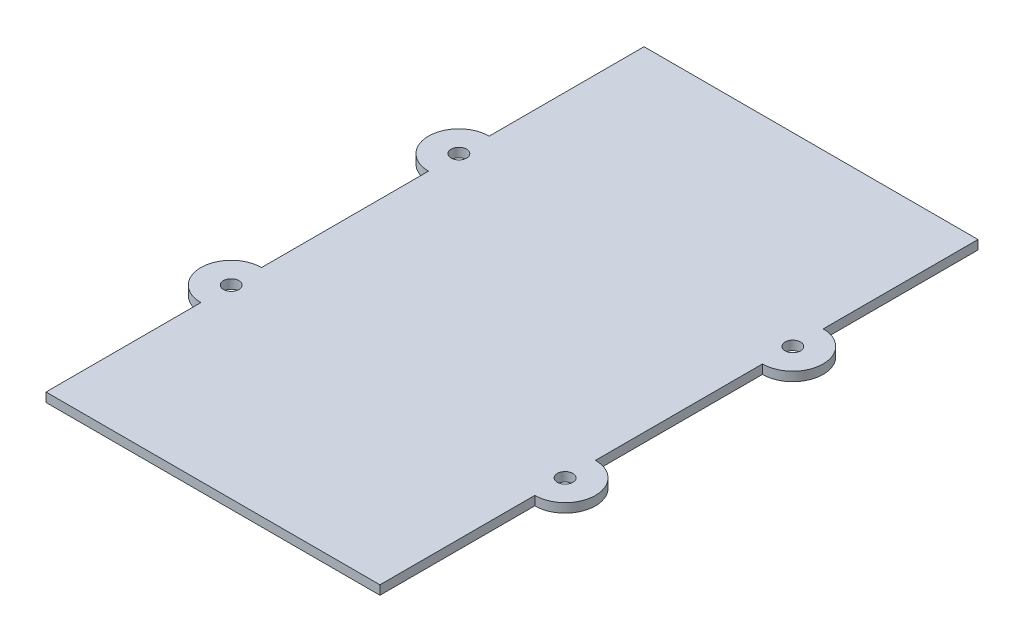
ISO-10303-21;
HEADER;
FILE_DESCRIPTION(('STEP AP214'),'2;1');
FILE_NAME('part.step','',(''),(''),'','','');
FILE_SCHEMA(('AUTOMOTIVE_DESIGN { 1 0 10303 214 1 1 1 1 }'));
ENDSEC;
DATA;
#1=APPLICATION_CONTEXT('core data for automotive mechanical design processes');
#2=APPLICATION_PROTOCOL_DEFINITION('international standard','automotive_design',2000,#1);
#3=PRODUCT_CONTEXT('',#1,'mechanical');
#4=PRODUCT('Part','Part','',(#3));
#5=PRODUCT_RELATED_PRODUCT_CATEGORY('part','',(#4));
#6=PRODUCT_DEFINITION_FORMATION('','',#4);
#7=PRODUCT_DEFINITION_CONTEXT('part definition',#1,'design');
#8=PRODUCT_DEFINITION('design','',#6,#7);
#9=PRODUCT_DEFINITION_SHAPE('','',#8);
#10=(LENGTH_UNIT() NAMED_UNIT(*) SI_UNIT(.MILLI.,.METRE.));
#11=(NAMED_UNIT(*) PLANE_ANGLE_UNIT() SI_UNIT($,.RADIAN.));
#12=(NAMED_UNIT(*) SI_UNIT($,.STERADIAN.) SOLID_ANGLE_UNIT());
#13=UNCERTAINTY_MEASURE_WITH_UNIT(LENGTH_MEASURE(1.E-05),#10,'distance_accuracy_value','');
#14=(GEOMETRIC_REPRESENTATION_CONTEXT(3) GLOBAL_UNCERTAINTY_ASSIGNED_CONTEXT((#13)) GLOBAL_UNIT_ASSIGNED_CONTEXT((#10,
#11,#12)) REPRESENTATION_CONTEXT('',''));
#15=CARTESIAN_POINT('',(0.,0.,0.));
#16=DIRECTION('',(0.,0.,1.));
#17=DIRECTION('',(1.,0.,0.));
#18=AXIS2_PLACEMENT_3D('',#15,#16,#17);
#19=CARTESIAN_POINT('',(-55.,3.,-37.5));
#20=DIRECTION('',(0.,1.,0.));
#21=DIRECTION('',(0.,0.,1.));
#22=AXIS2_PLACEMENT_3D('',#19,#20,#21);
#23=PLANE('',#22);
#24=CARTESIAN_POINT('',(-55.,3.,37.5));
#25=DIRECTION('',(0.,1.,0.));
#26=DIRECTION('',(0.,0.,1.));
#27=AXIS2_PLACEMENT_3D('',#24,#25,#26);
#28=CIRCLE('',#27,2.54999999999999);
#29=CARTESIAN_POINT('',(-55.,3.,40.05));
#30=VERTEX_POINT('',#29);
#31=EDGE_CURVE('E293',#30,#30,#28,.T.);
#32=ORIENTED_EDGE('',*,*,#31,.F.);
#33=EDGE_LOOP('',(#32));
#34=FACE_BOUND('',#33,.T.);
#35=CARTESIAN_POINT('',(-55.,3.,-37.5));
#36=DIRECTION('',(0.,1.,0.));
#37=DIRECTION('',(0.,0.,1.));
#38=AXIS2_PLACEMENT_3D('',#35,#36,#37);
#39=CIRCLE('',#38,2.54999999999999);
#40=CARTESIAN_POINT('',(-55.,3.,-34.95));
#41=VERTEX_POINT('',#40);
#42=EDGE_CURVE('E160',#41,#41,#39,.T.);
#43=ORIENTED_EDGE('',*,*,#42,.F.);
#44=EDGE_LOOP('',(#43));
#45=FACE_BOUND('',#44,.T.);
#46=CARTESIAN_POINT('',(-55.,3.,-37.5));
#47=DIRECTION('',(0.,1.,0.));
#48=DIRECTION('',(0.,0.,1.));
#49=AXIS2_PLACEMENT_3D('',#46,#47,#48);
#50=CIRCLE('',#49,10.);
#51=CARTESIAN_POINT('',(-55.,3.,-47.5));
#52=VERTEX_POINT('',#51);
#53=CARTESIAN_POINT('',(-55.,3.,-27.5));
#54=VERTEX_POINT('',#53);
#55=EDGE_CURVE('E179',#52,#54,#50,.T.);
#56=ORIENTED_EDGE('',*,*,#55,.T.);
#57=DIRECTION('',(0.,0.,1.));
#58=VECTOR('',#57,1.);
#59=CARTESIAN_POINT('',(-55.,3.,-27.5));
#60=LINE('',#59,#58);
#61=CARTESIAN_POINT('',(-55.,3.,27.5));
#62=VERTEX_POINT('',#61);
#63=EDGE_CURVE('E107',#54,#62,#60,.T.);
#64=ORIENTED_EDGE('',*,*,#63,.T.);
#65=CARTESIAN_POINT('',(-55.,3.,37.5));
#66=DIRECTION('',(0.,1.,0.));
#67=DIRECTION('',(0.,0.,1.));
#68=AXIS2_PLACEMENT_3D('',#65,#66,#67);
#69=CIRCLE('',#68,10.);
#70=CARTESIAN_POINT('',(-55.,3.,47.5));
#71=VERTEX_POINT('',#70);
#72=EDGE_CURVE('E206',#62,#71,#69,.T.);
#73=ORIENTED_EDGE('',*,*,#72,.T.);
#74=DIRECTION('',(0.,0.,1.));
#75=VECTOR('',#74,1.);
#76=CARTESIAN_POINT('',(-55.,3.,47.5));
#77=LINE('',#76,#75);
#78=CARTESIAN_POINT('',(-55.,3.,98.5));
#79=VERTEX_POINT('',#78);
#80=EDGE_CURVE('E225',#71,#79,#77,.T.);
#81=ORIENTED_EDGE('',*,*,#80,.T.);
#82=DIRECTION('',(1.,0.,0.));
#83=VECTOR('',#82,1.);
#84=CARTESIAN_POINT('',(-55.,3.,98.5));
#85=LINE('',#84,#83);
#86=CARTESIAN_POINT('',(55.,3.,98.5));
#87=VERTEX_POINT('',#86);
#88=EDGE_CURVE('E222',#79,#87,#85,.T.);
#89=ORIENTED_EDGE('',*,*,#88,.T.);
#90=DIRECTION('',(0.,0.,-1.));
#91=VECTOR('',#90,1.);
#92=CARTESIAN_POINT('',(55.,3.,47.5));
#93=LINE('',#92,#91);
#94=CARTESIAN_POINT('',(55.,3.,47.5));
#95=VERTEX_POINT('',#94);
#96=EDGE_CURVE('E224',#87,#95,#93,.T.);
#97=ORIENTED_EDGE('',*,*,#96,.T.);
#98=CARTESIAN_POINT('',(55.,3.,37.5));
#99=DIRECTION('',(0.,1.,0.));
#100=DIRECTION('',(0.,0.,-1.));
#101=AXIS2_PLACEMENT_3D('',#98,#99,#100);
#102=CIRCLE('',#101,10.);
#103=CARTESIAN_POINT('',(55.,3.,27.5));
#104=VERTEX_POINT('',#103);
#105=EDGE_CURVE('E227',#95,#104,#102,.T.);
#106=ORIENTED_EDGE('',*,*,#105,.T.);
#107=DIRECTION('',(0.,0.,-1.));
#108=VECTOR('',#107,1.);
#109=CARTESIAN_POINT('',(55.,3.,-27.5));
#110=LINE('',#109,#108);
#111=CARTESIAN_POINT('',(55.,3.,-27.5));
#112=VERTEX_POINT('',#111);
#113=EDGE_CURVE('E233',#104,#112,#110,.T.);
#114=ORIENTED_EDGE('',*,*,#113,.T.);
#115=CARTESIAN_POINT('',(55.,3.,-37.5));
#116=DIRECTION('',(0.,1.,0.));
#117=DIRECTION('',(0.,0.,-1.));
#118=AXIS2_PLACEMENT_3D('',#115,#116,#117);
#119=CIRCLE('',#118,10.);
#120=CARTESIAN_POINT('',(55.,3.,-47.5));
#121=VERTEX_POINT('',#120);
#122=EDGE_CURVE('E138',#112,#121,#119,.T.);
#123=ORIENTED_EDGE('',*,*,#122,.T.);
#124=DIRECTION('',(0.,0.,-1.));
#125=VECTOR('',#124,1.);
#126=CARTESIAN_POINT('',(55.,3.,-98.5));
#127=LINE('',#126,#125);
#128=CARTESIAN_POINT('',(55.,3.,-98.5));
#129=VERTEX_POINT('',#128);
#130=EDGE_CURVE('E132',#121,#129,#127,.T.);
#131=ORIENTED_EDGE('',*,*,#130,.T.);
#132=DIRECTION('',(-1.,0.,0.));
#133=VECTOR('',#132,1.);
#134=CARTESIAN_POINT('',(-55.,3.,-98.5));
#135=LINE('',#134,#133);
#136=CARTESIAN_POINT('',(-55.,3.,-98.5));
#137=VERTEX_POINT('',#136);
#138=EDGE_CURVE('E136',#129,#137,#135,.T.);
#139=ORIENTED_EDGE('',*,*,#138,.T.);
#140=DIRECTION('',(0.,0.,1.));
#141=VECTOR('',#140,1.);
#142=CARTESIAN_POINT('',(-55.,3.,-47.5));
#143=LINE('',#142,#141);
#144=EDGE_CURVE('E52',#137,#52,#143,.T.);
#145=ORIENTED_EDGE('',*,*,#144,.T.);
#146=EDGE_LOOP('',(#56,#64,#73,#81,#89,#97,#106,#114,#123,#131,#139,#145));
#147=FACE_BOUND('',#146,.T.);
#148=CARTESIAN_POINT('',(55.,3.,-37.5));
#149=DIRECTION('',(0.,1.,0.));
#150=DIRECTION('',(0.,0.,1.));
#151=AXIS2_PLACEMENT_3D('',#148,#149,#150);
#152=CIRCLE('',#151,2.55);
#153=CARTESIAN_POINT('',(55.,3.,-34.95));
#154=VERTEX_POINT('',#153);
#155=EDGE_CURVE('E299',#154,#154,#152,.T.);
#156=ORIENTED_EDGE('',*,*,#155,.F.);
#157=EDGE_LOOP('',(#156));
#158=FACE_BOUND('',#157,.T.);
#159=CARTESIAN_POINT('',(55.,3.,37.5));
#160=DIRECTION('',(0.,1.,0.));
#161=DIRECTION('',(0.,0.,1.));
#162=AXIS2_PLACEMENT_3D('',#159,#160,#161);
#163=CIRCLE('',#162,2.55);
#164=CARTESIAN_POINT('',(55.,3.,40.05));
#165=VERTEX_POINT('',#164);
#166=EDGE_CURVE('E284',#165,#165,#163,.T.);
#167=ORIENTED_EDGE('',*,*,#166,.F.);
#168=EDGE_LOOP('',(#167));
#169=FACE_BOUND('',#168,.T.);
#170=ADVANCED_FACE('F35',(#34,#45,#147,#158,#169),#23,.T.);
#171=CARTESIAN_POINT('',(-55.,0.,-37.5));
#172=DIRECTION('',(0.,1.,0.));
#173=DIRECTION('',(0.,0.,1.));
#174=AXIS2_PLACEMENT_3D('',#171,#172,#173);
#175=PLANE('',#174);
#176=CARTESIAN_POINT('',(-55.,0.,-37.5));
#177=DIRECTION('',(0.,1.,0.));
#178=DIRECTION('',(0.,0.,1.));
#179=AXIS2_PLACEMENT_3D('',#176,#177,#178);
#180=CIRCLE('',#179,10.);
#181=CARTESIAN_POINT('',(-55.,0.,-47.5));
#182=VERTEX_POINT('',#181);
#183=CARTESIAN_POINT('',(-55.,0.,-27.5));
#184=VERTEX_POINT('',#183);
#185=EDGE_CURVE('E156',#182,#184,#180,.T.);
#186=ORIENTED_EDGE('',*,*,#185,.F.);
#187=DIRECTION('',(0.,0.,1.));
#188=VECTOR('',#187,1.);
#189=CARTESIAN_POINT('',(-55.,0.,-47.5));
#190=LINE('',#189,#188);
#191=CARTESIAN_POINT('',(-55.,0.,-98.5));
#192=VERTEX_POINT('',#191);
#193=EDGE_CURVE('E99',#192,#182,#190,.T.);
#194=ORIENTED_EDGE('',*,*,#193,.F.);
#195=DIRECTION('',(-1.,0.,0.));
#196=VECTOR('',#195,1.);
#197=CARTESIAN_POINT('',(-55.,0.,-98.5));
#198=LINE('',#197,#196);
#199=CARTESIAN_POINT('',(55.,0.,-98.5));
#200=VERTEX_POINT('',#199);
#201=EDGE_CURVE('E93',#200,#192,#198,.T.);
#202=ORIENTED_EDGE('',*,*,#201,.F.);
#203=DIRECTION('',(0.,0.,-1.));
#204=VECTOR('',#203,1.);
#205=CARTESIAN_POINT('',(55.,0.,-98.5));
#206=LINE('',#205,#204);
#207=CARTESIAN_POINT('',(55.,0.,-47.5));
#208=VERTEX_POINT('',#207);
#209=EDGE_CURVE('E146',#208,#200,#206,.T.);
#210=ORIENTED_EDGE('',*,*,#209,.F.);
#211=CARTESIAN_POINT('',(55.,0.,-37.5));
#212=DIRECTION('',(0.,1.,0.));
#213=DIRECTION('',(0.,0.,-1.));
#214=AXIS2_PLACEMENT_3D('',#211,#212,#213);
#215=CIRCLE('',#214,10.);
#216=CARTESIAN_POINT('',(55.,0.,-27.5));
#217=VERTEX_POINT('',#216);
#218=EDGE_CURVE('E174',#217,#208,#215,.T.);
#219=ORIENTED_EDGE('',*,*,#218,.F.);
#220=DIRECTION('',(0.,0.,-1.));
#221=VECTOR('',#220,1.);
#222=CARTESIAN_POINT('',(55.,0.,-27.5));
#223=LINE('',#222,#221);
#224=CARTESIAN_POINT('',(55.,0.,27.5));
#225=VERTEX_POINT('',#224);
#226=EDGE_CURVE('E172',#225,#217,#223,.T.);
#227=ORIENTED_EDGE('',*,*,#226,.F.);
#228=CARTESIAN_POINT('',(55.,0.,37.5));
#229=DIRECTION('',(0.,1.,0.));
#230=DIRECTION('',(0.,0.,-1.));
#231=AXIS2_PLACEMENT_3D('',#228,#229,#230);
#232=CIRCLE('',#231,10.);
#233=CARTESIAN_POINT('',(55.,0.,47.5));
#234=VERTEX_POINT('',#233);
#235=EDGE_CURVE('E170',#234,#225,#232,.T.);
#236=ORIENTED_EDGE('',*,*,#235,.F.);
#237=DIRECTION('',(0.,0.,-1.));
#238=VECTOR('',#237,1.);
#239=CARTESIAN_POINT('',(55.,0.,47.5));
#240=LINE('',#239,#238);
#241=CARTESIAN_POINT('',(55.,0.,98.5));
#242=VERTEX_POINT('',#241);
#243=EDGE_CURVE('E168',#242,#234,#240,.T.);
#244=ORIENTED_EDGE('',*,*,#243,.F.);
#245=DIRECTION('',(1.,0.,0.));
#246=VECTOR('',#245,1.);
#247=CARTESIAN_POINT('',(-55.,0.,98.5));
#248=LINE('',#247,#246);
#249=CARTESIAN_POINT('',(-55.,0.,98.5));
#250=VERTEX_POINT('',#249);
#251=EDGE_CURVE('E166',#250,#242,#248,.T.);
#252=ORIENTED_EDGE('',*,*,#251,.F.);
#253=DIRECTION('',(0.,0.,1.));
#254=VECTOR('',#253,1.);
#255=CARTESIAN_POINT('',(-55.,0.,47.5));
#256=LINE('',#255,#254);
#257=CARTESIAN_POINT('',(-55.,0.,47.5));
#258=VERTEX_POINT('',#257);
#259=EDGE_CURVE('E164',#258,#250,#256,.T.);
#260=ORIENTED_EDGE('',*,*,#259,.F.);
#261=CARTESIAN_POINT('',(-55.,0.,37.5));
#262=DIRECTION('',(0.,1.,0.));
#263=DIRECTION('',(0.,0.,1.));
#264=AXIS2_PLACEMENT_3D('',#261,#262,#263);
#265=CIRCLE('',#264,10.);
#266=CARTESIAN_POINT('',(-55.,0.,27.5));
#267=VERTEX_POINT('',#266);
#268=EDGE_CURVE('E162',#267,#258,#265,.T.);
#269=ORIENTED_EDGE('',*,*,#268,.F.);
#270=DIRECTION('',(0.,0.,1.));
#271=VECTOR('',#270,1.);
#272=CARTESIAN_POINT('',(-55.,0.,-27.5));
#273=LINE('',#272,#271);
#274=EDGE_CURVE('E159',#184,#267,#273,.T.);
#275=ORIENTED_EDGE('',*,*,#274,.F.);
#276=EDGE_LOOP('',(#186,#194,#202,#210,#219,#227,#236,#244,#252,#260,#269,#275));
#277=FACE_BOUND('',#276,.T.);
#278=CARTESIAN_POINT('',(-55.,0.,-37.5));
#279=DIRECTION('',(0.,1.,0.));
#280=DIRECTION('',(0.,0.,1.));
#281=AXIS2_PLACEMENT_3D('',#278,#279,#280);
#282=CIRCLE('',#281,2.54999999999999);
#283=CARTESIAN_POINT('',(-55.,0.,-34.95));
#284=VERTEX_POINT('',#283);
#285=EDGE_CURVE('E302',#284,#284,#282,.T.);
#286=ORIENTED_EDGE('',*,*,#285,.T.);
#287=EDGE_LOOP('',(#286));
#288=FACE_BOUND('',#287,.T.);
#289=CARTESIAN_POINT('',(55.,0.,-37.5));
#290=DIRECTION('',(0.,1.,0.));
#291=DIRECTION('',(0.,0.,1.));
#292=AXIS2_PLACEMENT_3D('',#289,#290,#291);
#293=CIRCLE('',#292,2.55);
#294=CARTESIAN_POINT('',(55.,0.,-34.95));
#295=VERTEX_POINT('',#294);
#296=EDGE_CURVE('E296',#295,#295,#293,.T.);
#297=ORIENTED_EDGE('',*,*,#296,.T.);
#298=EDGE_LOOP('',(#297));
#299=FACE_BOUND('',#298,.T.);
#300=CARTESIAN_POINT('',(-55.,0.,37.5));
#301=DIRECTION('',(0.,1.,0.));
#302=DIRECTION('',(0.,0.,1.));
#303=AXIS2_PLACEMENT_3D('',#300,#301,#302);
#304=CIRCLE('',#303,2.54999999999999);
#305=CARTESIAN_POINT('',(-55.,0.,40.05));
#306=VERTEX_POINT('',#305);
#307=EDGE_CURVE('E290',#306,#306,#304,.T.);
#308=ORIENTED_EDGE('',*,*,#307,.T.);
#309=EDGE_LOOP('',(#308));
#310=FACE_BOUND('',#309,.T.);
#311=CARTESIAN_POINT('',(55.,0.,37.5));
#312=DIRECTION('',(0.,1.,0.));
#313=DIRECTION('',(0.,0.,1.));
#314=AXIS2_PLACEMENT_3D('',#311,#312,#313);
#315=CIRCLE('',#314,2.55);
#316=CARTESIAN_POINT('',(55.,0.,40.05));
#317=VERTEX_POINT('',#316);
#318=EDGE_CURVE('E287',#317,#317,#315,.T.);
#319=ORIENTED_EDGE('',*,*,#318,.T.);
#320=EDGE_LOOP('',(#319));
#321=FACE_BOUND('',#320,.T.);
#322=ADVANCED_FACE('F210',(#277,#288,#299,#310,#321),#175,.F.);
#323=CARTESIAN_POINT('',(-55.,3.,-37.5));
#324=DIRECTION('',(0.,-1.,0.));
#325=DIRECTION('',(0.,0.,-1.));
#326=AXIS2_PLACEMENT_3D('',#323,#324,#325);
#327=CYLINDRICAL_SURFACE('',#326,10.);
#328=ORIENTED_EDGE('',*,*,#185,.T.);
#329=DIRECTION('',(0.,-1.,0.));
#330=VECTOR('',#329,1.);
#331=CARTESIAN_POINT('',(-55.,3.,-27.5));
#332=LINE('',#331,#330);
#333=EDGE_CURVE('E11',#54,#184,#332,.T.);
#334=ORIENTED_EDGE('',*,*,#333,.F.);
#335=ORIENTED_EDGE('',*,*,#55,.F.);
#336=DIRECTION('',(0.,-1.,0.));
#337=VECTOR('',#336,1.);
#338=CARTESIAN_POINT('',(-55.,3.,-47.5));
#339=LINE('',#338,#337);
#340=EDGE_CURVE('E152',#52,#182,#339,.T.);
#341=ORIENTED_EDGE('',*,*,#340,.T.);
#342=EDGE_LOOP('',(#328,#334,#335,#341));
#343=FACE_BOUND('',#342,.T.);
#344=ADVANCED_FACE('F37',(#343),#327,.T.);
#345=CARTESIAN_POINT('',(-55.,3.,-27.5));
#346=DIRECTION('',(1.,0.,0.));
#347=DIRECTION('',(0.,0.,-1.));
#348=AXIS2_PLACEMENT_3D('',#345,#346,#347);
#349=PLANE('',#348);
#350=ORIENTED_EDGE('',*,*,#274,.T.);
#351=DIRECTION('',(0.,-1.,0.));
#352=VECTOR('',#351,1.);
#353=CARTESIAN_POINT('',(-55.,3.,27.5));
#354=LINE('',#353,#352);
#355=EDGE_CURVE('E44',#62,#267,#354,.T.);
#356=ORIENTED_EDGE('',*,*,#355,.F.);
#357=ORIENTED_EDGE('',*,*,#63,.F.);
#358=ORIENTED_EDGE('',*,*,#333,.T.);
#359=EDGE_LOOP('',(#350,#356,#357,#358));
#360=FACE_BOUND('',#359,.T.);
#361=ADVANCED_FACE('F412',(#360),#349,.F.);
#362=CARTESIAN_POINT('',(-55.,3.,37.5));
#363=DIRECTION('',(0.,-1.,0.));
#364=DIRECTION('',(0.,0.,-1.));
#365=AXIS2_PLACEMENT_3D('',#362,#363,#364);
#366=CYLINDRICAL_SURFACE('',#365,10.);
#367=ORIENTED_EDGE('',*,*,#268,.T.);
#368=DIRECTION('',(0.,-1.,0.));
#369=VECTOR('',#368,1.);
#370=CARTESIAN_POINT('',(-55.,3.,47.5));
#371=LINE('',#370,#369);
#372=EDGE_CURVE('E198',#71,#258,#371,.T.);
#373=ORIENTED_EDGE('',*,*,#372,.F.);
#374=ORIENTED_EDGE('',*,*,#72,.F.);
#375=ORIENTED_EDGE('',*,*,#355,.T.);
#376=EDGE_LOOP('',(#367,#373,#374,#375));
#377=FACE_BOUND('',#376,.T.);
#378=ADVANCED_FACE('F204',(#377),#366,.T.);
#379=CARTESIAN_POINT('',(-55.,3.,47.5));
#380=DIRECTION('',(1.,0.,0.));
#381=DIRECTION('',(0.,0.,-1.));
#382=AXIS2_PLACEMENT_3D('',#379,#380,#381);
#383=PLANE('',#382);
#384=ORIENTED_EDGE('',*,*,#259,.T.);
#385=DIRECTION('',(0.,-1.,0.));
#386=VECTOR('',#385,1.);
#387=CARTESIAN_POINT('',(-55.,3.,98.5));
#388=LINE('',#387,#386);
#389=EDGE_CURVE('E195',#79,#250,#388,.T.);
#390=ORIENTED_EDGE('',*,*,#389,.F.);
#391=ORIENTED_EDGE('',*,*,#80,.F.);
#392=ORIENTED_EDGE('',*,*,#372,.T.);
#393=EDGE_LOOP('',(#384,#390,#391,#392));
#394=FACE_BOUND('',#393,.T.);
#395=ADVANCED_FACE('F216',(#394),#383,.F.);
#396=CARTESIAN_POINT('',(-55.,3.,98.5));
#397=DIRECTION('',(0.,0.,-1.));
#398=DIRECTION('',(-1.,0.,0.));
#399=AXIS2_PLACEMENT_3D('',#396,#397,#398);
#400=PLANE('',#399);
#401=ORIENTED_EDGE('',*,*,#251,.T.);
#402=DIRECTION('',(0.,-1.,0.));
#403=VECTOR('',#402,1.);
#404=CARTESIAN_POINT('',(55.,3.,98.5));
#405=LINE('',#404,#403);
#406=EDGE_CURVE('E192',#87,#242,#405,.T.);
#407=ORIENTED_EDGE('',*,*,#406,.F.);
#408=ORIENTED_EDGE('',*,*,#88,.F.);
#409=ORIENTED_EDGE('',*,*,#389,.T.);
#410=EDGE_LOOP('',(#401,#407,#408,#409));
#411=FACE_BOUND('',#410,.T.);
#412=ADVANCED_FACE('F220',(#411),#400,.F.);
#413=CARTESIAN_POINT('',(55.,3.,47.5));
#414=DIRECTION('',(-1.,0.,0.));
#415=DIRECTION('',(0.,0.,1.));
#416=AXIS2_PLACEMENT_3D('',#413,#414,#415);
#417=PLANE('',#416);
#418=ORIENTED_EDGE('',*,*,#243,.T.);
#419=DIRECTION('',(0.,-1.,0.));
#420=VECTOR('',#419,1.);
#421=CARTESIAN_POINT('',(55.,3.,47.5));
#422=LINE('',#421,#420);
#423=EDGE_CURVE('E189',#95,#234,#422,.T.);
#424=ORIENTED_EDGE('',*,*,#423,.F.);
#425=ORIENTED_EDGE('',*,*,#96,.F.);
#426=ORIENTED_EDGE('',*,*,#406,.T.);
#427=EDGE_LOOP('',(#418,#424,#425,#426));
#428=FACE_BOUND('',#427,.T.);
#429=ADVANCED_FACE('F377',(#428),#417,.F.);
#430=CARTESIAN_POINT('',(55.,3.,37.5));
#431=DIRECTION('',(0.,-1.,0.));
#432=DIRECTION('',(0.,0.,-1.));
#433=AXIS2_PLACEMENT_3D('',#430,#431,#432);
#434=CYLINDRICAL_SURFACE('',#433,10.);
#435=ORIENTED_EDGE('',*,*,#235,.T.);
#436=DIRECTION('',(0.,-1.,0.));
#437=VECTOR('',#436,1.);
#438=CARTESIAN_POINT('',(55.,3.,27.5));
#439=LINE('',#438,#437);
#440=EDGE_CURVE('E186',#104,#225,#439,.T.);
#441=ORIENTED_EDGE('',*,*,#440,.F.);
#442=ORIENTED_EDGE('',*,*,#105,.F.);
#443=ORIENTED_EDGE('',*,*,#423,.T.);
#444=EDGE_LOOP('',(#435,#441,#442,#443));
#445=FACE_BOUND('',#444,.T.);
#446=ADVANCED_FACE('F368',(#445),#434,.T.);
#447=CARTESIAN_POINT('',(55.,3.,-27.5));
#448=DIRECTION('',(-1.,0.,0.));
#449=DIRECTION('',(0.,0.,1.));
#450=AXIS2_PLACEMENT_3D('',#447,#448,#449);
#451=PLANE('',#450);
#452=ORIENTED_EDGE('',*,*,#226,.T.);
#453=DIRECTION('',(0.,-1.,0.));
#454=VECTOR('',#453,1.);
#455=CARTESIAN_POINT('',(55.,3.,-27.5));
#456=LINE('',#455,#454);
#457=EDGE_CURVE('E183',#112,#217,#456,.T.);
#458=ORIENTED_EDGE('',*,*,#457,.F.);
#459=ORIENTED_EDGE('',*,*,#113,.F.);
#460=ORIENTED_EDGE('',*,*,#440,.T.);
#461=EDGE_LOOP('',(#452,#458,#459,#460));
#462=FACE_BOUND('',#461,.T.);
#463=ADVANCED_FACE('F239',(#462),#451,.F.);
#464=CARTESIAN_POINT('',(55.,3.,-37.5));
#465=DIRECTION('',(0.,-1.,0.));
#466=DIRECTION('',(0.,0.,-1.));
#467=AXIS2_PLACEMENT_3D('',#464,#465,#466);
#468=CYLINDRICAL_SURFACE('',#467,10.);
#469=ORIENTED_EDGE('',*,*,#218,.T.);
#470=DIRECTION('',(0.,-1.,0.));
#471=VECTOR('',#470,1.);
#472=CARTESIAN_POINT('',(55.,3.,-47.5));
#473=LINE('',#472,#471);
#474=EDGE_CURVE('E147',#121,#208,#473,.T.);
#475=ORIENTED_EDGE('',*,*,#474,.F.);
#476=ORIENTED_EDGE('',*,*,#122,.F.);
#477=ORIENTED_EDGE('',*,*,#457,.T.);
#478=EDGE_LOOP('',(#469,#475,#476,#477));
#479=FACE_BOUND('',#478,.T.);
#480=ADVANCED_FACE('F243',(#479),#468,.T.);
#481=CARTESIAN_POINT('',(55.,3.,-98.5));
#482=DIRECTION('',(-1.,0.,0.));
#483=DIRECTION('',(0.,0.,1.));
#484=AXIS2_PLACEMENT_3D('',#481,#482,#483);
#485=PLANE('',#484);
#486=ORIENTED_EDGE('',*,*,#209,.T.);
#487=DIRECTION('',(0.,-1.,0.));
#488=VECTOR('',#487,1.);
#489=CARTESIAN_POINT('',(55.,3.,-98.5));
#490=LINE('',#489,#488);
#491=EDGE_CURVE('E143',#129,#200,#490,.T.);
#492=ORIENTED_EDGE('',*,*,#491,.F.);
#493=ORIENTED_EDGE('',*,*,#130,.F.);
#494=ORIENTED_EDGE('',*,*,#474,.T.);
#495=EDGE_LOOP('',(#486,#492,#493,#494));
#496=FACE_BOUND('',#495,.T.);
#497=ADVANCED_FACE('F144',(#496),#485,.F.);
#498=CARTESIAN_POINT('',(-55.,3.,-98.5));
#499=DIRECTION('',(0.,0.,1.));
#500=DIRECTION('',(1.,0.,0.));
#501=AXIS2_PLACEMENT_3D('',#498,#499,#500);
#502=PLANE('',#501);
#503=ORIENTED_EDGE('',*,*,#201,.T.);
#504=DIRECTION('',(0.,-1.,0.));
#505=VECTOR('',#504,1.);
#506=CARTESIAN_POINT('',(-55.,3.,-98.5));
#507=LINE('',#506,#505);
#508=EDGE_CURVE('E148',#137,#192,#507,.T.);
#509=ORIENTED_EDGE('',*,*,#508,.F.);
#510=ORIENTED_EDGE('',*,*,#138,.F.);
#511=ORIENTED_EDGE('',*,*,#491,.T.);
#512=EDGE_LOOP('',(#503,#509,#510,#511));
#513=FACE_BOUND('',#512,.T.);
#514=ADVANCED_FACE('F150',(#513),#502,.F.);
#515=CARTESIAN_POINT('',(-55.,3.,-47.5));
#516=DIRECTION('',(1.,0.,0.));
#517=DIRECTION('',(0.,0.,-1.));
#518=AXIS2_PLACEMENT_3D('',#515,#516,#517);
#519=PLANE('',#518);
#520=ORIENTED_EDGE('',*,*,#193,.T.);
#521=ORIENTED_EDGE('',*,*,#340,.F.);
#522=ORIENTED_EDGE('',*,*,#144,.F.);
#523=ORIENTED_EDGE('',*,*,#508,.T.);
#524=EDGE_LOOP('',(#520,#521,#522,#523));
#525=FACE_BOUND('',#524,.T.);
#526=ADVANCED_FACE('F247',(#525),#519,.F.);
#527=CARTESIAN_POINT('',(-55.,3.,-37.5));
#528=DIRECTION('',(0.,-1.,0.));
#529=DIRECTION('',(0.,0.,-1.));
#530=AXIS2_PLACEMENT_3D('',#527,#528,#529);
#531=CYLINDRICAL_SURFACE('',#530,2.54999999999999);
#532=ORIENTED_EDGE('',*,*,#42,.T.);
#533=EDGE_LOOP('',(#532));
#534=FACE_BOUND('',#533,.T.);
#535=ORIENTED_EDGE('',*,*,#285,.F.);
#536=EDGE_LOOP('',(#535));
#537=FACE_BOUND('',#536,.T.);
#538=ADVANCED_FACE('F249',(#534,#537),#531,.F.);
#539=CARTESIAN_POINT('',(55.,3.,-37.5));
#540=DIRECTION('',(0.,-1.,0.));
#541=DIRECTION('',(0.,0.,-1.));
#542=AXIS2_PLACEMENT_3D('',#539,#540,#541);
#543=CYLINDRICAL_SURFACE('',#542,2.55);
#544=ORIENTED_EDGE('',*,*,#155,.T.);
#545=EDGE_LOOP('',(#544));
#546=FACE_BOUND('',#545,.T.);
#547=ORIENTED_EDGE('',*,*,#296,.F.);
#548=EDGE_LOOP('',(#547));
#549=FACE_BOUND('',#548,.T.);
#550=ADVANCED_FACE('F255',(#546,#549),#543,.F.);
#551=CARTESIAN_POINT('',(-55.,3.,37.5));
#552=DIRECTION('',(0.,-1.,0.));
#553=DIRECTION('',(0.,0.,-1.));
#554=AXIS2_PLACEMENT_3D('',#551,#552,#553);
#555=CYLINDRICAL_SURFACE('',#554,2.54999999999999);
#556=ORIENTED_EDGE('',*,*,#31,.T.);
#557=EDGE_LOOP('',(#556));
#558=FACE_BOUND('',#557,.T.);
#559=ORIENTED_EDGE('',*,*,#307,.F.);
#560=EDGE_LOOP('',(#559));
#561=FACE_BOUND('',#560,.T.);
#562=ADVANCED_FACE('F271',(#558,#561),#555,.F.);
#563=CARTESIAN_POINT('',(55.,3.,37.5));
#564=DIRECTION('',(0.,-1.,0.));
#565=DIRECTION('',(0.,0.,-1.));
#566=AXIS2_PLACEMENT_3D('',#563,#564,#565);
#567=CYLINDRICAL_SURFACE('',#566,2.55);
#568=ORIENTED_EDGE('',*,*,#166,.T.);
#569=EDGE_LOOP('',(#568));
#570=FACE_BOUND('',#569,.T.);
#571=ORIENTED_EDGE('',*,*,#318,.F.);
#572=EDGE_LOOP('',(#571));
#573=FACE_BOUND('',#572,.T.);
#574=ADVANCED_FACE('F275',(#570,#573),#567,.F.);
#575=CLOSED_SHELL('',(#170,#322,#344,#361,#378,#395,#412,#429,#446,#463,#480,#497,#514,#526,
#538,#550,#562,#574));
#576=MANIFOLD_SOLID_BREP('B2',#575);
#577=ADVANCED_BREP_SHAPE_REPRESENTATION('',(#18,#576),#14);
#578=SHAPE_DEFINITION_REPRESENTATION(#9,#577);
ENDSEC;
END-ISO-10303-21;
